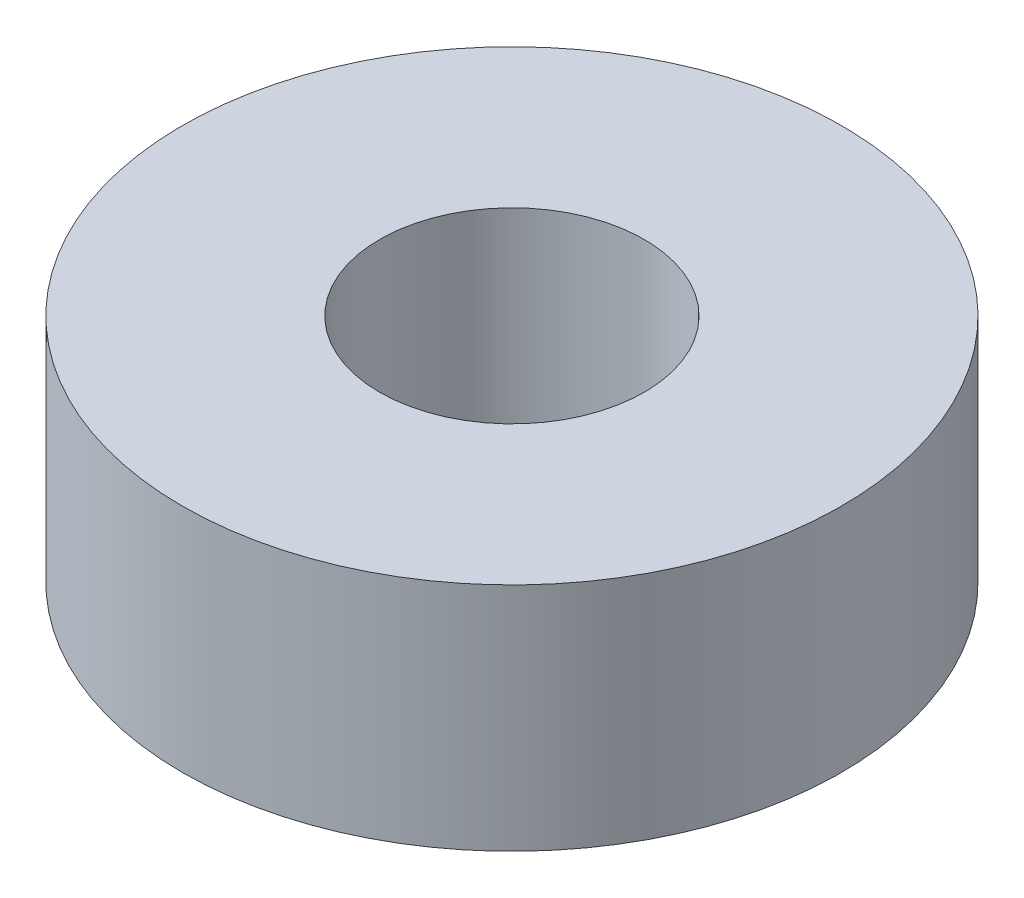
ISO-10303-21;
HEADER;
FILE_DESCRIPTION(('STEP AP214'),'2;1');
FILE_NAME('part.step','',(''),(''),'','','');
FILE_SCHEMA(('AUTOMOTIVE_DESIGN { 1 0 10303 214 1 1 1 1 }'));
ENDSEC;
DATA;
#1=APPLICATION_CONTEXT('core data for automotive mechanical design processes');
#2=APPLICATION_PROTOCOL_DEFINITION('international standard','automotive_design',2000,#1);
#3=PRODUCT_CONTEXT('',#1,'mechanical');
#4=PRODUCT('Part','Part','',(#3));
#5=PRODUCT_RELATED_PRODUCT_CATEGORY('part','',(#4));
#6=PRODUCT_DEFINITION_FORMATION('','',#4);
#7=PRODUCT_DEFINITION_CONTEXT('part definition',#1,'design');
#8=PRODUCT_DEFINITION('design','',#6,#7);
#9=PRODUCT_DEFINITION_SHAPE('','',#8);
#10=(LENGTH_UNIT() NAMED_UNIT(*) SI_UNIT(.MILLI.,.METRE.));
#11=(NAMED_UNIT(*) PLANE_ANGLE_UNIT() SI_UNIT($,.RADIAN.));
#12=(NAMED_UNIT(*) SI_UNIT($,.STERADIAN.) SOLID_ANGLE_UNIT());
#13=UNCERTAINTY_MEASURE_WITH_UNIT(LENGTH_MEASURE(1.E-05),#10,'distance_accuracy_value','');
#14=(GEOMETRIC_REPRESENTATION_CONTEXT(3) GLOBAL_UNCERTAINTY_ASSIGNED_CONTEXT((#13)) GLOBAL_UNIT_ASSIGNED_CONTEXT((#10,
#11,#12)) REPRESENTATION_CONTEXT('',''));
#15=CARTESIAN_POINT('',(0.,0.,0.));
#16=DIRECTION('',(0.,0.,1.));
#17=DIRECTION('',(1.,0.,0.));
#18=AXIS2_PLACEMENT_3D('',#15,#16,#17);
#19=CARTESIAN_POINT('',(0.,4.445,0.));
#20=DIRECTION('',(0.,1.,0.));
#21=DIRECTION('',(0.,0.,1.));
#22=AXIS2_PLACEMENT_3D('',#19,#20,#21);
#23=PLANE('',#22);
#24=CARTESIAN_POINT('',(0.,4.445,0.));
#25=DIRECTION('',(0.,1.,0.));
#26=DIRECTION('',(0.,0.,1.));
#27=AXIS2_PLACEMENT_3D('',#24,#25,#26);
#28=CIRCLE('',#27,6.35);
#29=CARTESIAN_POINT('',(0.,4.445,6.35));
#30=VERTEX_POINT('',#29);
#31=EDGE_CURVE('E10',#30,#30,#28,.T.);
#32=ORIENTED_EDGE('',*,*,#31,.T.);
#33=EDGE_LOOP('',(#32));
#34=FACE_BOUND('',#33,.T.);
#35=CARTESIAN_POINT('',(0.,4.445,0.));
#36=DIRECTION('',(0.,1.,0.));
#37=DIRECTION('',(0.,0.,1.));
#38=AXIS2_PLACEMENT_3D('',#35,#36,#37);
#39=CIRCLE('',#38,2.55);
#40=CARTESIAN_POINT('',(0.,4.445,2.55));
#41=VERTEX_POINT('',#40);
#42=EDGE_CURVE('E42',#41,#41,#39,.T.);
#43=ORIENTED_EDGE('',*,*,#42,.F.);
#44=EDGE_LOOP('',(#43));
#45=FACE_BOUND('',#44,.T.);
#46=ADVANCED_FACE('F31',(#34,#45),#23,.T.);
#47=CARTESIAN_POINT('',(0.,0.,0.));
#48=DIRECTION('',(0.,1.,0.));
#49=DIRECTION('',(0.,0.,1.));
#50=AXIS2_PLACEMENT_3D('',#47,#48,#49);
#51=PLANE('',#50);
#52=CARTESIAN_POINT('',(0.,0.,0.));
#53=DIRECTION('',(0.,1.,0.));
#54=DIRECTION('',(0.,0.,1.));
#55=AXIS2_PLACEMENT_3D('',#52,#53,#54);
#56=CIRCLE('',#55,6.35);
#57=CARTESIAN_POINT('',(0.,0.,6.35));
#58=VERTEX_POINT('',#57);
#59=EDGE_CURVE('E35',#58,#58,#56,.T.);
#60=ORIENTED_EDGE('',*,*,#59,.F.);
#61=EDGE_LOOP('',(#60));
#62=FACE_BOUND('',#61,.T.);
#63=CARTESIAN_POINT('',(0.,0.,0.));
#64=DIRECTION('',(0.,1.,0.));
#65=DIRECTION('',(0.,0.,1.));
#66=AXIS2_PLACEMENT_3D('',#63,#64,#65);
#67=CIRCLE('',#66,2.55);
#68=CARTESIAN_POINT('',(0.,0.,2.55));
#69=VERTEX_POINT('',#68);
#70=EDGE_CURVE('E44',#69,#69,#67,.T.);
#71=ORIENTED_EDGE('',*,*,#70,.T.);
#72=EDGE_LOOP('',(#71));
#73=FACE_BOUND('',#72,.T.);
#74=ADVANCED_FACE('F54',(#62,#73),#51,.F.);
#75=CARTESIAN_POINT('',(0.,4.445,0.));
#76=DIRECTION('',(0.,-1.,0.));
#77=DIRECTION('',(0.,0.,-1.));
#78=AXIS2_PLACEMENT_3D('',#75,#76,#77);
#79=CYLINDRICAL_SURFACE('',#78,6.35);
#80=ORIENTED_EDGE('',*,*,#31,.F.);
#81=EDGE_LOOP('',(#80));
#82=FACE_BOUND('',#81,.T.);
#83=ORIENTED_EDGE('',*,*,#59,.T.);
#84=EDGE_LOOP('',(#83));
#85=FACE_BOUND('',#84,.T.);
#86=ADVANCED_FACE('F33',(#82,#85),#79,.T.);
#87=CARTESIAN_POINT('',(0.,4.445,0.));
#88=DIRECTION('',(0.,-1.,0.));
#89=DIRECTION('',(0.,0.,-1.));
#90=AXIS2_PLACEMENT_3D('',#87,#88,#89);
#91=CYLINDRICAL_SURFACE('',#90,2.55);
#92=ORIENTED_EDGE('',*,*,#42,.T.);
#93=EDGE_LOOP('',(#92));
#94=FACE_BOUND('',#93,.T.);
#95=ORIENTED_EDGE('',*,*,#70,.F.);
#96=EDGE_LOOP('',(#95));
#97=FACE_BOUND('',#96,.T.);
#98=ADVANCED_FACE('F50',(#94,#97),#91,.F.);
#99=CLOSED_SHELL('',(#46,#74,#86,#98));
#100=MANIFOLD_SOLID_BREP('B2',#99);
#101=ADVANCED_BREP_SHAPE_REPRESENTATION('',(#18,#100),#14);
#102=SHAPE_DEFINITION_REPRESENTATION(#9,#101);
ENDSEC;
END-ISO-10303-21;
